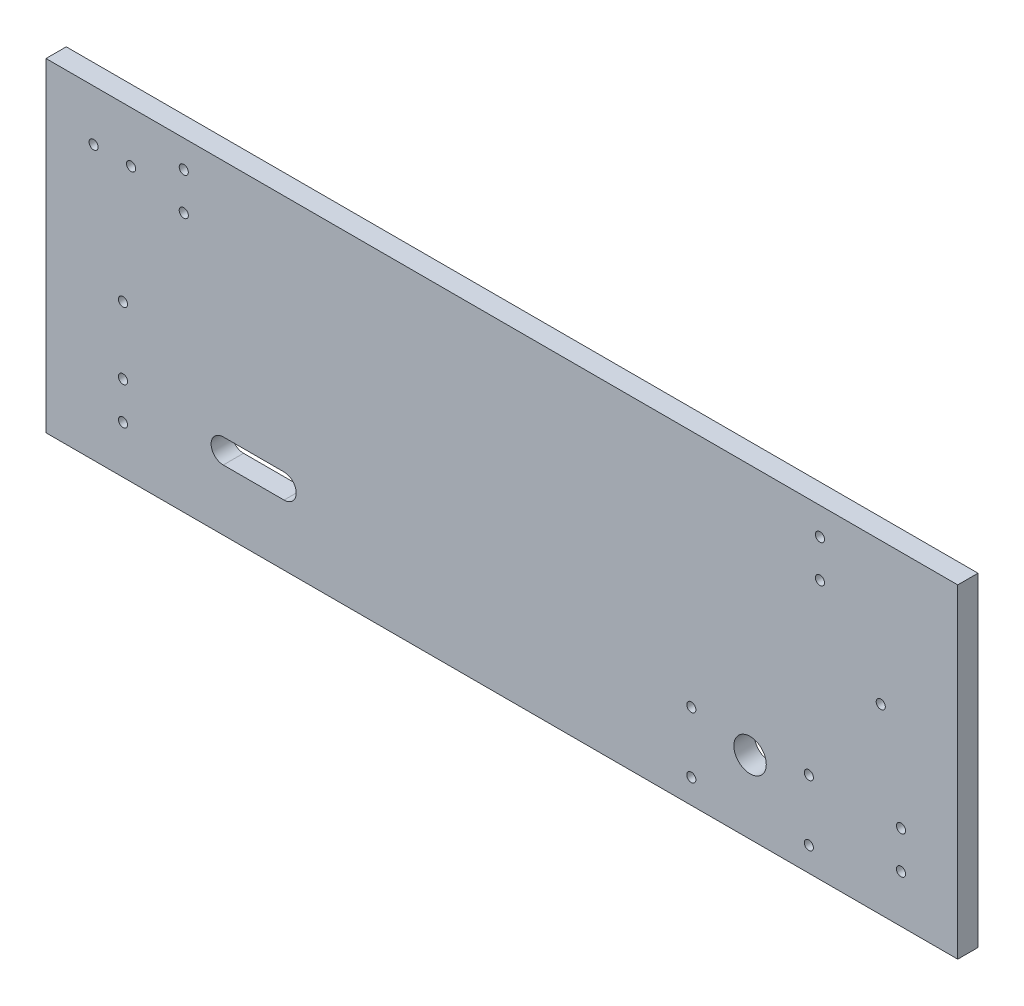
ISO-10303-21;
HEADER;
FILE_DESCRIPTION(('STEP AP214'),'2;1');
FILE_NAME('part.step','',(''),(''),'','','');
FILE_SCHEMA(('AUTOMOTIVE_DESIGN { 1 0 10303 214 1 1 1 1 }'));
ENDSEC;
DATA;
#1=APPLICATION_CONTEXT('core data for automotive mechanical design processes');
#2=APPLICATION_PROTOCOL_DEFINITION('international standard','automotive_design',2000,#1);
#3=PRODUCT_CONTEXT('',#1,'mechanical');
#4=PRODUCT('Part','Part','',(#3));
#5=PRODUCT_RELATED_PRODUCT_CATEGORY('part','',(#4));
#6=PRODUCT_DEFINITION_FORMATION('','',#4);
#7=PRODUCT_DEFINITION_CONTEXT('part definition',#1,'design');
#8=PRODUCT_DEFINITION('design','',#6,#7);
#9=PRODUCT_DEFINITION_SHAPE('','',#8);
#10=(LENGTH_UNIT() NAMED_UNIT(*) SI_UNIT(.MILLI.,.METRE.));
#11=(NAMED_UNIT(*) PLANE_ANGLE_UNIT() SI_UNIT($,.RADIAN.));
#12=(NAMED_UNIT(*) SI_UNIT($,.STERADIAN.) SOLID_ANGLE_UNIT());
#13=UNCERTAINTY_MEASURE_WITH_UNIT(LENGTH_MEASURE(1.E-05),#10,'distance_accuracy_value','');
#14=(GEOMETRIC_REPRESENTATION_CONTEXT(3) GLOBAL_UNCERTAINTY_ASSIGNED_CONTEXT((#13)) GLOBAL_UNIT_ASSIGNED_CONTEXT((#10,
#11,#12)) REPRESENTATION_CONTEXT('',''));
#15=CARTESIAN_POINT('',(0.,0.,0.));
#16=DIRECTION('',(0.,0.,1.));
#17=DIRECTION('',(1.,0.,0.));
#18=AXIS2_PLACEMENT_3D('',#15,#16,#17);
#19=CARTESIAN_POINT('',(0.,0.,10.));
#20=DIRECTION('',(1.,0.,0.));
#21=DIRECTION('',(0.,0.,-1.));
#22=AXIS2_PLACEMENT_3D('',#19,#20,#21);
#23=PLANE('',#22);
#24=DIRECTION('',(0.,-1.,0.));
#25=VECTOR('',#24,1.);
#26=CARTESIAN_POINT('',(0.,0.,0.));
#27=LINE('',#26,#25);
#28=CARTESIAN_POINT('',(0.,160.,0.));
#29=VERTEX_POINT('',#28);
#30=CARTESIAN_POINT('',(0.,0.,0.));
#31=VERTEX_POINT('',#30);
#32=EDGE_CURVE('E158',#29,#31,#27,.T.);
#33=ORIENTED_EDGE('',*,*,#32,.T.);
#34=DIRECTION('',(0.,0.,-1.));
#35=VECTOR('',#34,1.);
#36=CARTESIAN_POINT('',(0.,0.,10.));
#37=LINE('',#36,#35);
#38=CARTESIAN_POINT('',(0.,0.,10.));
#39=VERTEX_POINT('',#38);
#40=EDGE_CURVE('E11',#39,#31,#37,.T.);
#41=ORIENTED_EDGE('',*,*,#40,.F.);
#42=DIRECTION('',(0.,-1.,0.));
#43=VECTOR('',#42,1.);
#44=CARTESIAN_POINT('',(0.,0.,10.));
#45=LINE('',#44,#43);
#46=CARTESIAN_POINT('',(0.,160.,10.));
#47=VERTEX_POINT('',#46);
#48=EDGE_CURVE('E160',#47,#39,#45,.T.);
#49=ORIENTED_EDGE('',*,*,#48,.F.);
#50=DIRECTION('',(0.,0.,-1.));
#51=VECTOR('',#50,1.);
#52=CARTESIAN_POINT('',(0.,160.,10.));
#53=LINE('',#52,#51);
#54=EDGE_CURVE('E170',#47,#29,#53,.T.);
#55=ORIENTED_EDGE('',*,*,#54,.T.);
#56=EDGE_LOOP('',(#33,#41,#49,#55));
#57=FACE_BOUND('',#56,.T.);
#58=ADVANCED_FACE('F37',(#57),#23,.F.);
#59=CARTESIAN_POINT('',(0.,0.,10.));
#60=DIRECTION('',(0.,1.,0.));
#61=DIRECTION('',(0.,0.,1.));
#62=AXIS2_PLACEMENT_3D('',#59,#60,#61);
#63=PLANE('',#62);
#64=DIRECTION('',(1.,0.,0.));
#65=VECTOR('',#64,1.);
#66=CARTESIAN_POINT('',(0.,0.,0.));
#67=LINE('',#66,#65);
#68=CARTESIAN_POINT('',(450.,0.,0.));
#69=VERTEX_POINT('',#68);
#70=EDGE_CURVE('E173',#31,#69,#67,.T.);
#71=ORIENTED_EDGE('',*,*,#70,.T.);
#72=DIRECTION('',(0.,0.,-1.));
#73=VECTOR('',#72,1.);
#74=CARTESIAN_POINT('',(450.,0.,10.));
#75=LINE('',#74,#73);
#76=CARTESIAN_POINT('',(450.,0.,10.));
#77=VERTEX_POINT('',#76);
#78=EDGE_CURVE('E44',#77,#69,#75,.T.);
#79=ORIENTED_EDGE('',*,*,#78,.F.);
#80=DIRECTION('',(1.,0.,0.));
#81=VECTOR('',#80,1.);
#82=CARTESIAN_POINT('',(0.,0.,10.));
#83=LINE('',#82,#81);
#84=EDGE_CURVE('E163',#39,#77,#83,.T.);
#85=ORIENTED_EDGE('',*,*,#84,.F.);
#86=ORIENTED_EDGE('',*,*,#40,.T.);
#87=EDGE_LOOP('',(#71,#79,#85,#86));
#88=FACE_BOUND('',#87,.T.);
#89=ADVANCED_FACE('F202',(#88),#63,.F.);
#90=CARTESIAN_POINT('',(450.,0.,10.));
#91=DIRECTION('',(-1.,0.,0.));
#92=DIRECTION('',(0.,0.,1.));
#93=AXIS2_PLACEMENT_3D('',#90,#91,#92);
#94=PLANE('',#93);
#95=DIRECTION('',(0.,1.,0.));
#96=VECTOR('',#95,1.);
#97=CARTESIAN_POINT('',(450.,0.,0.));
#98=LINE('',#97,#96);
#99=CARTESIAN_POINT('',(450.,160.,0.));
#100=VERTEX_POINT('',#99);
#101=EDGE_CURVE('E175',#69,#100,#98,.T.);
#102=ORIENTED_EDGE('',*,*,#101,.T.);
#103=DIRECTION('',(0.,0.,-1.));
#104=VECTOR('',#103,1.);
#105=CARTESIAN_POINT('',(450.,160.,10.));
#106=LINE('',#105,#104);
#107=CARTESIAN_POINT('',(450.,160.,10.));
#108=VERTEX_POINT('',#107);
#109=EDGE_CURVE('E180',#108,#100,#106,.T.);
#110=ORIENTED_EDGE('',*,*,#109,.F.);
#111=DIRECTION('',(0.,1.,0.));
#112=VECTOR('',#111,1.);
#113=CARTESIAN_POINT('',(450.,0.,10.));
#114=LINE('',#113,#112);
#115=EDGE_CURVE('E166',#77,#108,#114,.T.);
#116=ORIENTED_EDGE('',*,*,#115,.F.);
#117=ORIENTED_EDGE('',*,*,#78,.T.);
#118=EDGE_LOOP('',(#102,#110,#116,#117));
#119=FACE_BOUND('',#118,.T.);
#120=ADVANCED_FACE('F187',(#119),#94,.F.);
#121=CARTESIAN_POINT('',(0.,160.,10.));
#122=DIRECTION('',(0.,-1.,0.));
#123=DIRECTION('',(0.,0.,-1.));
#124=AXIS2_PLACEMENT_3D('',#121,#122,#123);
#125=PLANE('',#124);
#126=DIRECTION('',(-1.,0.,0.));
#127=VECTOR('',#126,1.);
#128=CARTESIAN_POINT('',(0.,160.,0.));
#129=LINE('',#128,#127);
#130=EDGE_CURVE('E164',#100,#29,#129,.T.);
#131=ORIENTED_EDGE('',*,*,#130,.T.);
#132=ORIENTED_EDGE('',*,*,#54,.F.);
#133=DIRECTION('',(-1.,0.,0.));
#134=VECTOR('',#133,1.);
#135=CARTESIAN_POINT('',(0.,160.,10.));
#136=LINE('',#135,#134);
#137=EDGE_CURVE('E168',#108,#47,#136,.T.);
#138=ORIENTED_EDGE('',*,*,#137,.F.);
#139=ORIENTED_EDGE('',*,*,#109,.T.);
#140=EDGE_LOOP('',(#131,#132,#138,#139));
#141=FACE_BOUND('',#140,.T.);
#142=ADVANCED_FACE('F196',(#141),#125,.F.);
#143=CARTESIAN_POINT('',(0.,0.,10.));
#144=DIRECTION('',(0.,0.,-1.));
#145=DIRECTION('',(-1.,0.,0.));
#146=AXIS2_PLACEMENT_3D('',#143,#144,#145);
#147=PLANE('',#146);
#148=CARTESIAN_POINT('',(382.,146.5,10.));
#149=DIRECTION('',(0.,0.,1.));
#150=DIRECTION('',(1.,0.,0.));
#151=AXIS2_PLACEMENT_3D('',#148,#149,#150);
#152=CIRCLE('',#151,2.24999999999996);
#153=CARTESIAN_POINT('',(384.25,146.5,10.));
#154=VERTEX_POINT('',#153);
#155=EDGE_CURVE('E341',#154,#154,#152,.T.);
#156=ORIENTED_EDGE('',*,*,#155,.F.);
#157=EDGE_LOOP('',(#156));
#158=FACE_BOUND('',#157,.T.);
#159=CARTESIAN_POINT('',(68.,128.,10.));
#160=DIRECTION('',(0.,0.,1.));
#161=DIRECTION('',(1.,0.,0.));
#162=AXIS2_PLACEMENT_3D('',#159,#160,#161);
#163=CIRCLE('',#162,2.25);
#164=CARTESIAN_POINT('',(70.25,128.,10.));
#165=VERTEX_POINT('',#164);
#166=EDGE_CURVE('E334',#165,#165,#163,.T.);
#167=ORIENTED_EDGE('',*,*,#166,.F.);
#168=EDGE_LOOP('',(#167));
#169=FACE_BOUND('',#168,.T.);
#170=CARTESIAN_POINT('',(412.,90.,10.));
#171=DIRECTION('',(0.,0.,1.));
#172=DIRECTION('',(1.,0.,0.));
#173=AXIS2_PLACEMENT_3D('',#170,#171,#172);
#174=CIRCLE('',#173,2.24999999999995);
#175=CARTESIAN_POINT('',(414.25,90.,10.));
#176=VERTEX_POINT('',#175);
#177=EDGE_CURVE('E353',#176,#176,#174,.T.);
#178=ORIENTED_EDGE('',*,*,#177,.F.);
#179=EDGE_LOOP('',(#178));
#180=FACE_BOUND('',#179,.T.);
#181=CARTESIAN_POINT('',(68.,146.5,10.));
#182=DIRECTION('',(0.,0.,1.));
#183=DIRECTION('',(1.,0.,0.));
#184=AXIS2_PLACEMENT_3D('',#181,#182,#183);
#185=CIRCLE('',#184,2.25);
#186=CARTESIAN_POINT('',(70.25,146.5,10.));
#187=VERTEX_POINT('',#186);
#188=EDGE_CURVE('E346',#187,#187,#185,.T.);
#189=ORIENTED_EDGE('',*,*,#188,.F.);
#190=EDGE_LOOP('',(#189));
#191=FACE_BOUND('',#190,.T.);
#192=CARTESIAN_POINT('',(422.,41.9999999999999,10.));
#193=DIRECTION('',(0.,0.,1.));
#194=DIRECTION('',(1.,0.,0.));
#195=AXIS2_PLACEMENT_3D('',#192,#193,#194);
#196=CIRCLE('',#195,2.24999999999995);
#197=CARTESIAN_POINT('',(424.25,41.9999999999999,10.));
#198=VERTEX_POINT('',#197);
#199=EDGE_CURVE('E309',#198,#198,#196,.T.);
#200=ORIENTED_EDGE('',*,*,#199,.F.);
#201=EDGE_LOOP('',(#200));
#202=FACE_BOUND('',#201,.T.);
#203=CARTESIAN_POINT('',(38.,23.5,10.));
#204=DIRECTION('',(0.,0.,1.));
#205=DIRECTION('',(1.,0.,0.));
#206=AXIS2_PLACEMENT_3D('',#203,#204,#205);
#207=CIRCLE('',#206,2.25);
#208=CARTESIAN_POINT('',(40.25,23.5,10.));
#209=VERTEX_POINT('',#208);
#210=EDGE_CURVE('E313',#209,#209,#207,.T.);
#211=ORIENTED_EDGE('',*,*,#210,.F.);
#212=EDGE_LOOP('',(#211));
#213=FACE_BOUND('',#212,.T.);
#214=CARTESIAN_POINT('',(38.,42.,10.));
#215=DIRECTION('',(0.,0.,1.));
#216=DIRECTION('',(1.,0.,0.));
#217=AXIS2_PLACEMENT_3D('',#214,#215,#216);
#218=CIRCLE('',#217,2.25);
#219=CARTESIAN_POINT('',(40.25,42.,10.));
#220=VERTEX_POINT('',#219);
#221=EDGE_CURVE('E329',#220,#220,#218,.T.);
#222=ORIENTED_EDGE('',*,*,#221,.F.);
#223=EDGE_LOOP('',(#222));
#224=FACE_BOUND('',#223,.T.);
#225=CARTESIAN_POINT('',(382.,128.,10.));
#226=DIRECTION('',(0.,0.,1.));
#227=DIRECTION('',(1.,0.,0.));
#228=AXIS2_PLACEMENT_3D('',#225,#226,#227);
#229=CIRCLE('',#228,2.24999999999996);
#230=CARTESIAN_POINT('',(384.25,128.,10.));
#231=VERTEX_POINT('',#230);
#232=EDGE_CURVE('E322',#231,#231,#229,.T.);
#233=ORIENTED_EDGE('',*,*,#232,.F.);
#234=EDGE_LOOP('',(#233));
#235=FACE_BOUND('',#234,.T.);
#236=DIRECTION('',(1.,0.,0.));
#237=VECTOR('',#236,1.);
#238=CARTESIAN_POINT('',(87.5,30.,10.));
#239=LINE('',#238,#237);
#240=CARTESIAN_POINT('',(87.5,30.,10.));
#241=VERTEX_POINT('',#240);
#242=CARTESIAN_POINT('',(117.5,30.,10.));
#243=VERTEX_POINT('',#242);
#244=EDGE_CURVE('E122',#241,#243,#239,.T.);
#245=ORIENTED_EDGE('',*,*,#244,.F.);
#246=CARTESIAN_POINT('',(87.5,36.,10.));
#247=DIRECTION('',(0.,0.,1.));
#248=DIRECTION('',(1.,0.,0.));
#249=AXIS2_PLACEMENT_3D('',#246,#247,#248);
#250=CIRCLE('',#249,6.);
#251=CARTESIAN_POINT('',(87.5,42.,10.));
#252=VERTEX_POINT('',#251);
#253=EDGE_CURVE('E51',#252,#241,#250,.T.);
#254=ORIENTED_EDGE('',*,*,#253,.F.);
#255=DIRECTION('',(-1.,0.,0.));
#256=VECTOR('',#255,1.);
#257=CARTESIAN_POINT('',(87.5,42.,10.));
#258=LINE('',#257,#256);
#259=CARTESIAN_POINT('',(117.5,42.,10.));
#260=VERTEX_POINT('',#259);
#261=EDGE_CURVE('E111',#260,#252,#258,.T.);
#262=ORIENTED_EDGE('',*,*,#261,.F.);
#263=CARTESIAN_POINT('',(117.5,36.,10.));
#264=DIRECTION('',(0.,0.,1.));
#265=DIRECTION('',(1.,0.,0.));
#266=AXIS2_PLACEMENT_3D('',#263,#264,#265);
#267=CIRCLE('',#266,6.);
#268=EDGE_CURVE('E116',#243,#260,#267,.T.);
#269=ORIENTED_EDGE('',*,*,#268,.F.);
#270=EDGE_LOOP('',(#245,#254,#262,#269));
#271=FACE_BOUND('',#270,.T.);
#272=CARTESIAN_POINT('',(376.5,42.,10.));
#273=DIRECTION('',(0.,0.,1.));
#274=DIRECTION('',(1.,0.,0.));
#275=AXIS2_PLACEMENT_3D('',#272,#273,#274);
#276=CIRCLE('',#275,2.24999999999995);
#277=CARTESIAN_POINT('',(378.75,42.,10.));
#278=VERTEX_POINT('',#277);
#279=EDGE_CURVE('E108',#278,#278,#276,.T.);
#280=ORIENTED_EDGE('',*,*,#279,.F.);
#281=EDGE_LOOP('',(#280));
#282=FACE_BOUND('',#281,.T.);
#283=CARTESIAN_POINT('',(376.5,12.,10.));
#284=DIRECTION('',(0.,0.,1.));
#285=DIRECTION('',(1.,0.,0.));
#286=AXIS2_PLACEMENT_3D('',#283,#284,#285);
#287=CIRCLE('',#286,2.24999999999995);
#288=CARTESIAN_POINT('',(378.75,12.,10.));
#289=VERTEX_POINT('',#288);
#290=EDGE_CURVE('E144',#289,#289,#287,.T.);
#291=ORIENTED_EDGE('',*,*,#290,.F.);
#292=EDGE_LOOP('',(#291));
#293=FACE_BOUND('',#292,.T.);
#294=CARTESIAN_POINT('',(318.5,12.,10.));
#295=DIRECTION('',(0.,0.,1.));
#296=DIRECTION('',(1.,0.,0.));
#297=AXIS2_PLACEMENT_3D('',#294,#295,#296);
#298=CIRCLE('',#297,2.24999999999995);
#299=CARTESIAN_POINT('',(320.75,12.,10.));
#300=VERTEX_POINT('',#299);
#301=EDGE_CURVE('E150',#300,#300,#298,.T.);
#302=ORIENTED_EDGE('',*,*,#301,.F.);
#303=EDGE_LOOP('',(#302));
#304=FACE_BOUND('',#303,.T.);
#305=CARTESIAN_POINT('',(38.,75.,10.));
#306=DIRECTION('',(0.,0.,1.));
#307=DIRECTION('',(1.,0.,0.));
#308=AXIS2_PLACEMENT_3D('',#305,#306,#307);
#309=CIRCLE('',#308,2.25);
#310=CARTESIAN_POINT('',(40.25,75.,10.));
#311=VERTEX_POINT('',#310);
#312=EDGE_CURVE('E365',#311,#311,#309,.T.);
#313=ORIENTED_EDGE('',*,*,#312,.F.);
#314=EDGE_LOOP('',(#313));
#315=FACE_BOUND('',#314,.T.);
#316=CARTESIAN_POINT('',(42.,134.933694221876,10.));
#317=DIRECTION('',(0.,0.,1.));
#318=DIRECTION('',(1.,0.,0.));
#319=AXIS2_PLACEMENT_3D('',#316,#317,#318);
#320=CIRCLE('',#319,2.25);
#321=CARTESIAN_POINT('',(44.25,134.933694221876,10.));
#322=VERTEX_POINT('',#321);
#323=EDGE_CURVE('E358',#322,#322,#320,.T.);
#324=ORIENTED_EDGE('',*,*,#323,.F.);
#325=EDGE_LOOP('',(#324));
#326=FACE_BOUND('',#325,.T.);
#327=CARTESIAN_POINT('',(23.5,134.933694221876,10.));
#328=DIRECTION('',(0.,0.,1.));
#329=DIRECTION('',(1.,0.,0.));
#330=AXIS2_PLACEMENT_3D('',#327,#328,#329);
#331=CIRCLE('',#330,2.25);
#332=CARTESIAN_POINT('',(25.75,134.933694221876,10.));
#333=VERTEX_POINT('',#332);
#334=EDGE_CURVE('E375',#333,#333,#331,.T.);
#335=ORIENTED_EDGE('',*,*,#334,.F.);
#336=EDGE_LOOP('',(#335));
#337=FACE_BOUND('',#336,.T.);
#338=CARTESIAN_POINT('',(318.5,42.,10.));
#339=DIRECTION('',(0.,0.,1.));
#340=DIRECTION('',(1.,0.,0.));
#341=AXIS2_PLACEMENT_3D('',#338,#339,#340);
#342=CIRCLE('',#341,2.24999999999995);
#343=CARTESIAN_POINT('',(320.75,42.,10.));
#344=VERTEX_POINT('',#343);
#345=EDGE_CURVE('E156',#344,#344,#342,.T.);
#346=ORIENTED_EDGE('',*,*,#345,.F.);
#347=EDGE_LOOP('',(#346));
#348=FACE_BOUND('',#347,.T.);
#349=CARTESIAN_POINT('',(422.,23.4999999999999,10.));
#350=DIRECTION('',(0.,0.,1.));
#351=DIRECTION('',(1.,0.,0.));
#352=AXIS2_PLACEMENT_3D('',#349,#350,#351);
#353=CIRCLE('',#352,2.24999999999995);
#354=CARTESIAN_POINT('',(424.25,23.4999999999999,10.));
#355=VERTEX_POINT('',#354);
#356=EDGE_CURVE('E304',#355,#355,#353,.T.);
#357=ORIENTED_EDGE('',*,*,#356,.F.);
#358=EDGE_LOOP('',(#357));
#359=FACE_BOUND('',#358,.T.);
#360=CARTESIAN_POINT('',(347.5,36.,10.));
#361=DIRECTION('',(0.,0.,1.));
#362=DIRECTION('',(1.,0.,0.));
#363=AXIS2_PLACEMENT_3D('',#360,#361,#362);
#364=CIRCLE('',#363,7.99999999999998);
#365=CARTESIAN_POINT('',(355.5,36.,10.));
#366=VERTEX_POINT('',#365);
#367=EDGE_CURVE('E123',#366,#366,#364,.T.);
#368=ORIENTED_EDGE('',*,*,#367,.F.);
#369=EDGE_LOOP('',(#368));
#370=FACE_BOUND('',#369,.T.);
#371=ORIENTED_EDGE('',*,*,#48,.T.);
#372=ORIENTED_EDGE('',*,*,#84,.T.);
#373=ORIENTED_EDGE('',*,*,#115,.T.);
#374=ORIENTED_EDGE('',*,*,#137,.T.);
#375=EDGE_LOOP('',(#371,#372,#373,#374));
#376=FACE_BOUND('',#375,.T.);
#377=ADVANCED_FACE('F119',(#158,#169,#180,#191,#202,#213,#224,#235,#271,#282,#293,#304,#315,
#326,#337,#348,#359,#370,#376),#147,.F.);
#378=CARTESIAN_POINT('',(0.,0.,0.));
#379=DIRECTION('',(0.,0.,-1.));
#380=DIRECTION('',(-1.,0.,0.));
#381=AXIS2_PLACEMENT_3D('',#378,#379,#380);
#382=PLANE('',#381);
#383=CARTESIAN_POINT('',(382.,146.5,0.));
#384=DIRECTION('',(0.,0.,1.));
#385=DIRECTION('',(1.,0.,0.));
#386=AXIS2_PLACEMENT_3D('',#383,#384,#385);
#387=CIRCLE('',#386,2.24999999999996);
#388=CARTESIAN_POINT('',(384.25,146.5,0.));
#389=VERTEX_POINT('',#388);
#390=EDGE_CURVE('E325',#389,#389,#387,.T.);
#391=ORIENTED_EDGE('',*,*,#390,.T.);
#392=EDGE_LOOP('',(#391));
#393=FACE_BOUND('',#392,.T.);
#394=CARTESIAN_POINT('',(68.,128.,0.));
#395=DIRECTION('',(0.,0.,1.));
#396=DIRECTION('',(1.,0.,0.));
#397=AXIS2_PLACEMENT_3D('',#394,#395,#396);
#398=CIRCLE('',#397,2.25);
#399=CARTESIAN_POINT('',(70.25,128.,0.));
#400=VERTEX_POINT('',#399);
#401=EDGE_CURVE('E338',#400,#400,#398,.T.);
#402=ORIENTED_EDGE('',*,*,#401,.T.);
#403=EDGE_LOOP('',(#402));
#404=FACE_BOUND('',#403,.T.);
#405=CARTESIAN_POINT('',(412.,90.,0.));
#406=DIRECTION('',(0.,0.,1.));
#407=DIRECTION('',(1.,0.,0.));
#408=AXIS2_PLACEMENT_3D('',#405,#406,#407);
#409=CIRCLE('',#408,2.24999999999995);
#410=CARTESIAN_POINT('',(414.25,90.,0.));
#411=VERTEX_POINT('',#410);
#412=EDGE_CURVE('E337',#411,#411,#409,.T.);
#413=ORIENTED_EDGE('',*,*,#412,.T.);
#414=EDGE_LOOP('',(#413));
#415=FACE_BOUND('',#414,.T.);
#416=CARTESIAN_POINT('',(68.,146.5,0.));
#417=DIRECTION('',(0.,0.,1.));
#418=DIRECTION('',(1.,0.,0.));
#419=AXIS2_PLACEMENT_3D('',#416,#417,#418);
#420=CIRCLE('',#419,2.25);
#421=CARTESIAN_POINT('',(70.25,146.5,0.));
#422=VERTEX_POINT('',#421);
#423=EDGE_CURVE('E350',#422,#422,#420,.T.);
#424=ORIENTED_EDGE('',*,*,#423,.T.);
#425=EDGE_LOOP('',(#424));
#426=FACE_BOUND('',#425,.T.);
#427=CARTESIAN_POINT('',(422.,41.9999999999999,0.));
#428=DIRECTION('',(0.,0.,1.));
#429=DIRECTION('',(1.,0.,0.));
#430=AXIS2_PLACEMENT_3D('',#427,#428,#429);
#431=CIRCLE('',#430,2.24999999999995);
#432=CARTESIAN_POINT('',(424.25,41.9999999999999,0.));
#433=VERTEX_POINT('',#432);
#434=EDGE_CURVE('E306',#433,#433,#431,.T.);
#435=ORIENTED_EDGE('',*,*,#434,.T.);
#436=EDGE_LOOP('',(#435));
#437=FACE_BOUND('',#436,.T.);
#438=CARTESIAN_POINT('',(38.,23.5,0.));
#439=DIRECTION('',(0.,0.,1.));
#440=DIRECTION('',(1.,0.,0.));
#441=AXIS2_PLACEMENT_3D('',#438,#439,#440);
#442=CIRCLE('',#441,2.25);
#443=CARTESIAN_POINT('',(40.25,23.5,0.));
#444=VERTEX_POINT('',#443);
#445=EDGE_CURVE('E317',#444,#444,#442,.T.);
#446=ORIENTED_EDGE('',*,*,#445,.T.);
#447=EDGE_LOOP('',(#446));
#448=FACE_BOUND('',#447,.T.);
#449=CARTESIAN_POINT('',(38.,42.,0.));
#450=DIRECTION('',(0.,0.,1.));
#451=DIRECTION('',(1.,0.,0.));
#452=AXIS2_PLACEMENT_3D('',#449,#450,#451);
#453=CIRCLE('',#452,2.25);
#454=CARTESIAN_POINT('',(40.25,42.,0.));
#455=VERTEX_POINT('',#454);
#456=EDGE_CURVE('E316',#455,#455,#453,.T.);
#457=ORIENTED_EDGE('',*,*,#456,.T.);
#458=EDGE_LOOP('',(#457));
#459=FACE_BOUND('',#458,.T.);
#460=CARTESIAN_POINT('',(382.,128.,0.));
#461=DIRECTION('',(0.,0.,1.));
#462=DIRECTION('',(1.,0.,0.));
#463=AXIS2_PLACEMENT_3D('',#460,#461,#462);
#464=CIRCLE('',#463,2.24999999999996);
#465=CARTESIAN_POINT('',(384.25,128.,0.));
#466=VERTEX_POINT('',#465);
#467=EDGE_CURVE('E326',#466,#466,#464,.T.);
#468=ORIENTED_EDGE('',*,*,#467,.T.);
#469=EDGE_LOOP('',(#468));
#470=FACE_BOUND('',#469,.T.);
#471=CARTESIAN_POINT('',(87.5,36.,0.));
#472=DIRECTION('',(0.,0.,1.));
#473=DIRECTION('',(1.,0.,0.));
#474=AXIS2_PLACEMENT_3D('',#471,#472,#473);
#475=CIRCLE('',#474,6.);
#476=CARTESIAN_POINT('',(87.5,42.,0.));
#477=VERTEX_POINT('',#476);
#478=CARTESIAN_POINT('',(87.5,30.,0.));
#479=VERTEX_POINT('',#478);
#480=EDGE_CURVE('E103',#477,#479,#475,.T.);
#481=ORIENTED_EDGE('',*,*,#480,.T.);
#482=DIRECTION('',(1.,0.,0.));
#483=VECTOR('',#482,1.);
#484=CARTESIAN_POINT('',(87.5,30.,0.));
#485=LINE('',#484,#483);
#486=CARTESIAN_POINT('',(117.5,30.,0.));
#487=VERTEX_POINT('',#486);
#488=EDGE_CURVE('E135',#479,#487,#485,.T.);
#489=ORIENTED_EDGE('',*,*,#488,.T.);
#490=CARTESIAN_POINT('',(117.5,36.,0.));
#491=DIRECTION('',(0.,0.,1.));
#492=DIRECTION('',(1.,0.,0.));
#493=AXIS2_PLACEMENT_3D('',#490,#491,#492);
#494=CIRCLE('',#493,6.);
#495=CARTESIAN_POINT('',(117.5,42.,0.));
#496=VERTEX_POINT('',#495);
#497=EDGE_CURVE('E59',#487,#496,#494,.T.);
#498=ORIENTED_EDGE('',*,*,#497,.T.);
#499=DIRECTION('',(-1.,0.,0.));
#500=VECTOR('',#499,1.);
#501=CARTESIAN_POINT('',(87.5,42.,0.));
#502=LINE('',#501,#500);
#503=EDGE_CURVE('E131',#496,#477,#502,.T.);
#504=ORIENTED_EDGE('',*,*,#503,.T.);
#505=EDGE_LOOP('',(#481,#489,#498,#504));
#506=FACE_BOUND('',#505,.T.);
#507=CARTESIAN_POINT('',(376.5,42.,0.));
#508=DIRECTION('',(0.,0.,1.));
#509=DIRECTION('',(1.,0.,0.));
#510=AXIS2_PLACEMENT_3D('',#507,#508,#509);
#511=CIRCLE('',#510,2.24999999999995);
#512=CARTESIAN_POINT('',(378.75,42.,0.));
#513=VERTEX_POINT('',#512);
#514=EDGE_CURVE('E141',#513,#513,#511,.T.);
#515=ORIENTED_EDGE('',*,*,#514,.T.);
#516=EDGE_LOOP('',(#515));
#517=FACE_BOUND('',#516,.T.);
#518=CARTESIAN_POINT('',(376.5,12.,0.));
#519=DIRECTION('',(0.,0.,1.));
#520=DIRECTION('',(1.,0.,0.));
#521=AXIS2_PLACEMENT_3D('',#518,#519,#520);
#522=CIRCLE('',#521,2.24999999999995);
#523=CARTESIAN_POINT('',(378.75,12.,0.));
#524=VERTEX_POINT('',#523);
#525=EDGE_CURVE('E147',#524,#524,#522,.T.);
#526=ORIENTED_EDGE('',*,*,#525,.T.);
#527=EDGE_LOOP('',(#526));
#528=FACE_BOUND('',#527,.T.);
#529=CARTESIAN_POINT('',(318.5,12.,0.));
#530=DIRECTION('',(0.,0.,1.));
#531=DIRECTION('',(1.,0.,0.));
#532=AXIS2_PLACEMENT_3D('',#529,#530,#531);
#533=CIRCLE('',#532,2.24999999999995);
#534=CARTESIAN_POINT('',(320.75,12.,0.));
#535=VERTEX_POINT('',#534);
#536=EDGE_CURVE('E153',#535,#535,#533,.T.);
#537=ORIENTED_EDGE('',*,*,#536,.T.);
#538=EDGE_LOOP('',(#537));
#539=FACE_BOUND('',#538,.T.);
#540=CARTESIAN_POINT('',(38.,75.,0.));
#541=DIRECTION('',(0.,0.,1.));
#542=DIRECTION('',(1.,0.,0.));
#543=AXIS2_PLACEMENT_3D('',#540,#541,#542);
#544=CIRCLE('',#543,2.25);
#545=CARTESIAN_POINT('',(40.25,75.,0.));
#546=VERTEX_POINT('',#545);
#547=EDGE_CURVE('E349',#546,#546,#544,.T.);
#548=ORIENTED_EDGE('',*,*,#547,.T.);
#549=EDGE_LOOP('',(#548));
#550=FACE_BOUND('',#549,.T.);
#551=CARTESIAN_POINT('',(42.,134.933694221876,0.));
#552=DIRECTION('',(0.,0.,1.));
#553=DIRECTION('',(1.,0.,0.));
#554=AXIS2_PLACEMENT_3D('',#551,#552,#553);
#555=CIRCLE('',#554,2.25);
#556=CARTESIAN_POINT('',(44.25,134.933694221876,0.));
#557=VERTEX_POINT('',#556);
#558=EDGE_CURVE('E362',#557,#557,#555,.T.);
#559=ORIENTED_EDGE('',*,*,#558,.T.);
#560=EDGE_LOOP('',(#559));
#561=FACE_BOUND('',#560,.T.);
#562=CARTESIAN_POINT('',(23.5,134.933694221876,0.));
#563=DIRECTION('',(0.,0.,1.));
#564=DIRECTION('',(1.,0.,0.));
#565=AXIS2_PLACEMENT_3D('',#562,#563,#564);
#566=CIRCLE('',#565,2.25);
#567=CARTESIAN_POINT('',(25.75,134.933694221876,0.));
#568=VERTEX_POINT('',#567);
#569=EDGE_CURVE('E361',#568,#568,#566,.T.);
#570=ORIENTED_EDGE('',*,*,#569,.T.);
#571=EDGE_LOOP('',(#570));
#572=FACE_BOUND('',#571,.T.);
#573=CARTESIAN_POINT('',(318.5,42.,0.));
#574=DIRECTION('',(0.,0.,1.));
#575=DIRECTION('',(1.,0.,0.));
#576=AXIS2_PLACEMENT_3D('',#573,#574,#575);
#577=CIRCLE('',#576,2.24999999999995);
#578=CARTESIAN_POINT('',(320.75,42.,0.));
#579=VERTEX_POINT('',#578);
#580=EDGE_CURVE('E372',#579,#579,#577,.T.);
#581=ORIENTED_EDGE('',*,*,#580,.T.);
#582=EDGE_LOOP('',(#581));
#583=FACE_BOUND('',#582,.T.);
#584=CARTESIAN_POINT('',(422.,23.4999999999999,0.));
#585=DIRECTION('',(0.,0.,1.));
#586=DIRECTION('',(1.,0.,0.));
#587=AXIS2_PLACEMENT_3D('',#584,#585,#586);
#588=CIRCLE('',#587,2.24999999999995);
#589=CARTESIAN_POINT('',(424.25,23.4999999999999,0.));
#590=VERTEX_POINT('',#589);
#591=EDGE_CURVE('E301',#590,#590,#588,.T.);
#592=ORIENTED_EDGE('',*,*,#591,.T.);
#593=EDGE_LOOP('',(#592));
#594=FACE_BOUND('',#593,.T.);
#595=CARTESIAN_POINT('',(347.5,36.,0.));
#596=DIRECTION('',(0.,0.,1.));
#597=DIRECTION('',(1.,0.,0.));
#598=AXIS2_PLACEMENT_3D('',#595,#596,#597);
#599=CIRCLE('',#598,7.99999999999998);
#600=CARTESIAN_POINT('',(355.5,36.,0.));
#601=VERTEX_POINT('',#600);
#602=EDGE_CURVE('E126',#601,#601,#599,.T.);
#603=ORIENTED_EDGE('',*,*,#602,.T.);
#604=EDGE_LOOP('',(#603));
#605=FACE_BOUND('',#604,.T.);
#606=ORIENTED_EDGE('',*,*,#32,.F.);
#607=ORIENTED_EDGE('',*,*,#130,.F.);
#608=ORIENTED_EDGE('',*,*,#101,.F.);
#609=ORIENTED_EDGE('',*,*,#70,.F.);
#610=EDGE_LOOP('',(#606,#607,#608,#609));
#611=FACE_BOUND('',#610,.T.);
#612=ADVANCED_FACE('F193',(#393,#404,#415,#426,#437,#448,#459,#470,#506,#517,#528,#539,#550,
#561,#572,#583,#594,#605,#611),#382,.T.);
#613=CARTESIAN_POINT('',(347.5,36.,0.));
#614=DIRECTION('',(0.,0.,1.));
#615=DIRECTION('',(1.,0.,0.));
#616=AXIS2_PLACEMENT_3D('',#613,#614,#615);
#617=CYLINDRICAL_SURFACE('',#616,7.99999999999998);
#618=ORIENTED_EDGE('',*,*,#602,.F.);
#619=EDGE_LOOP('',(#618));
#620=FACE_BOUND('',#619,.T.);
#621=ORIENTED_EDGE('',*,*,#367,.T.);
#622=EDGE_LOOP('',(#621));
#623=FACE_BOUND('',#622,.T.);
#624=ADVANCED_FACE('F214',(#620,#623),#617,.F.);
#625=CARTESIAN_POINT('',(422.,23.4999999999999,0.));
#626=DIRECTION('',(0.,0.,1.));
#627=DIRECTION('',(1.,0.,0.));
#628=AXIS2_PLACEMENT_3D('',#625,#626,#627);
#629=CYLINDRICAL_SURFACE('',#628,2.24999999999995);
#630=ORIENTED_EDGE('',*,*,#591,.F.);
#631=EDGE_LOOP('',(#630));
#632=FACE_BOUND('',#631,.T.);
#633=ORIENTED_EDGE('',*,*,#356,.T.);
#634=EDGE_LOOP('',(#633));
#635=FACE_BOUND('',#634,.T.);
#636=ADVANCED_FACE('F221',(#632,#635),#629,.F.);
#637=CARTESIAN_POINT('',(318.5,42.,0.));
#638=DIRECTION('',(0.,0.,1.));
#639=DIRECTION('',(1.,0.,0.));
#640=AXIS2_PLACEMENT_3D('',#637,#638,#639);
#641=CYLINDRICAL_SURFACE('',#640,2.24999999999995);
#642=ORIENTED_EDGE('',*,*,#580,.F.);
#643=EDGE_LOOP('',(#642));
#644=FACE_BOUND('',#643,.T.);
#645=ORIENTED_EDGE('',*,*,#345,.T.);
#646=EDGE_LOOP('',(#645));
#647=FACE_BOUND('',#646,.T.);
#648=ADVANCED_FACE('F252',(#644,#647),#641,.F.);
#649=CARTESIAN_POINT('',(23.5,134.933694221876,0.));
#650=DIRECTION('',(0.,0.,1.));
#651=DIRECTION('',(1.,0.,0.));
#652=AXIS2_PLACEMENT_3D('',#649,#650,#651);
#653=CYLINDRICAL_SURFACE('',#652,2.25);
#654=ORIENTED_EDGE('',*,*,#569,.F.);
#655=EDGE_LOOP('',(#654));
#656=FACE_BOUND('',#655,.T.);
#657=ORIENTED_EDGE('',*,*,#334,.T.);
#658=EDGE_LOOP('',(#657));
#659=FACE_BOUND('',#658,.T.);
#660=ADVANCED_FACE('F248',(#656,#659),#653,.F.);
#661=CARTESIAN_POINT('',(42.,134.933694221876,0.));
#662=DIRECTION('',(0.,0.,1.));
#663=DIRECTION('',(1.,0.,0.));
#664=AXIS2_PLACEMENT_3D('',#661,#662,#663);
#665=CYLINDRICAL_SURFACE('',#664,2.25);
#666=ORIENTED_EDGE('',*,*,#558,.F.);
#667=EDGE_LOOP('',(#666));
#668=FACE_BOUND('',#667,.T.);
#669=ORIENTED_EDGE('',*,*,#323,.T.);
#670=EDGE_LOOP('',(#669));
#671=FACE_BOUND('',#670,.T.);
#672=ADVANCED_FACE('F251',(#668,#671),#665,.F.);
#673=CARTESIAN_POINT('',(38.,75.,0.));
#674=DIRECTION('',(0.,0.,1.));
#675=DIRECTION('',(1.,0.,0.));
#676=AXIS2_PLACEMENT_3D('',#673,#674,#675);
#677=CYLINDRICAL_SURFACE('',#676,2.25);
#678=ORIENTED_EDGE('',*,*,#547,.F.);
#679=EDGE_LOOP('',(#678));
#680=FACE_BOUND('',#679,.T.);
#681=ORIENTED_EDGE('',*,*,#312,.T.);
#682=EDGE_LOOP('',(#681));
#683=FACE_BOUND('',#682,.T.);
#684=ADVANCED_FACE('F227',(#680,#683),#677,.F.);
#685=CARTESIAN_POINT('',(318.5,12.,0.));
#686=DIRECTION('',(0.,0.,1.));
#687=DIRECTION('',(1.,0.,0.));
#688=AXIS2_PLACEMENT_3D('',#685,#686,#687);
#689=CYLINDRICAL_SURFACE('',#688,2.24999999999995);
#690=ORIENTED_EDGE('',*,*,#536,.F.);
#691=EDGE_LOOP('',(#690));
#692=FACE_BOUND('',#691,.T.);
#693=ORIENTED_EDGE('',*,*,#301,.T.);
#694=EDGE_LOOP('',(#693));
#695=FACE_BOUND('',#694,.T.);
#696=ADVANCED_FACE('F223',(#692,#695),#689,.F.);
#697=CARTESIAN_POINT('',(376.5,12.,0.));
#698=DIRECTION('',(0.,0.,1.));
#699=DIRECTION('',(1.,0.,0.));
#700=AXIS2_PLACEMENT_3D('',#697,#698,#699);
#701=CYLINDRICAL_SURFACE('',#700,2.24999999999995);
#702=ORIENTED_EDGE('',*,*,#525,.F.);
#703=EDGE_LOOP('',(#702));
#704=FACE_BOUND('',#703,.T.);
#705=ORIENTED_EDGE('',*,*,#290,.T.);
#706=EDGE_LOOP('',(#705));
#707=FACE_BOUND('',#706,.T.);
#708=ADVANCED_FACE('F226',(#704,#707),#701,.F.);
#709=CARTESIAN_POINT('',(376.5,42.,0.));
#710=DIRECTION('',(0.,0.,1.));
#711=DIRECTION('',(1.,0.,0.));
#712=AXIS2_PLACEMENT_3D('',#709,#710,#711);
#713=CYLINDRICAL_SURFACE('',#712,2.24999999999995);
#714=ORIENTED_EDGE('',*,*,#514,.F.);
#715=EDGE_LOOP('',(#714));
#716=FACE_BOUND('',#715,.T.);
#717=ORIENTED_EDGE('',*,*,#279,.T.);
#718=EDGE_LOOP('',(#717));
#719=FACE_BOUND('',#718,.T.);
#720=ADVANCED_FACE('F231',(#716,#719),#713,.F.);
#721=CARTESIAN_POINT('',(87.5,36.,0.));
#722=DIRECTION('',(0.,0.,1.));
#723=DIRECTION('',(1.,0.,0.));
#724=AXIS2_PLACEMENT_3D('',#721,#722,#723);
#725=CYLINDRICAL_SURFACE('',#724,6.);
#726=ORIENTED_EDGE('',*,*,#253,.T.);
#727=DIRECTION('',(0.,0.,1.));
#728=VECTOR('',#727,1.);
#729=CARTESIAN_POINT('',(87.5,30.,0.));
#730=LINE('',#729,#728);
#731=EDGE_CURVE('E133',#479,#241,#730,.T.);
#732=ORIENTED_EDGE('',*,*,#731,.F.);
#733=ORIENTED_EDGE('',*,*,#480,.F.);
#734=DIRECTION('',(0.,0.,1.));
#735=VECTOR('',#734,1.);
#736=CARTESIAN_POINT('',(87.5,42.,0.));
#737=LINE('',#736,#735);
#738=EDGE_CURVE('E99',#477,#252,#737,.T.);
#739=ORIENTED_EDGE('',*,*,#738,.T.);
#740=EDGE_LOOP('',(#726,#732,#733,#739));
#741=FACE_BOUND('',#740,.T.);
#742=ADVANCED_FACE('F101',(#741),#725,.F.);
#743=CARTESIAN_POINT('',(87.5,42.,0.));
#744=DIRECTION('',(0.,1.,0.));
#745=DIRECTION('',(-1.,0.,0.));
#746=AXIS2_PLACEMENT_3D('',#743,#744,#745);
#747=PLANE('',#746);
#748=ORIENTED_EDGE('',*,*,#261,.T.);
#749=ORIENTED_EDGE('',*,*,#738,.F.);
#750=ORIENTED_EDGE('',*,*,#503,.F.);
#751=DIRECTION('',(0.,0.,1.));
#752=VECTOR('',#751,1.);
#753=CARTESIAN_POINT('',(117.5,42.,0.));
#754=LINE('',#753,#752);
#755=EDGE_CURVE('E107',#496,#260,#754,.T.);
#756=ORIENTED_EDGE('',*,*,#755,.T.);
#757=EDGE_LOOP('',(#748,#749,#750,#756));
#758=FACE_BOUND('',#757,.T.);
#759=ADVANCED_FACE('F112',(#758),#747,.F.);
#760=CARTESIAN_POINT('',(117.5,36.,0.));
#761=DIRECTION('',(0.,0.,1.));
#762=DIRECTION('',(1.,0.,0.));
#763=AXIS2_PLACEMENT_3D('',#760,#761,#762);
#764=CYLINDRICAL_SURFACE('',#763,6.);
#765=ORIENTED_EDGE('',*,*,#268,.T.);
#766=ORIENTED_EDGE('',*,*,#755,.F.);
#767=ORIENTED_EDGE('',*,*,#497,.F.);
#768=DIRECTION('',(0.,0.,1.));
#769=VECTOR('',#768,1.);
#770=CARTESIAN_POINT('',(117.5,30.,0.));
#771=LINE('',#770,#769);
#772=EDGE_CURVE('E381',#487,#243,#771,.T.);
#773=ORIENTED_EDGE('',*,*,#772,.T.);
#774=EDGE_LOOP('',(#765,#766,#767,#773));
#775=FACE_BOUND('',#774,.T.);
#776=ADVANCED_FACE('F238',(#775),#764,.F.);
#777=CARTESIAN_POINT('',(87.5,30.,0.));
#778=DIRECTION('',(0.,-1.,0.));
#779=DIRECTION('',(1.,0.,0.));
#780=AXIS2_PLACEMENT_3D('',#777,#778,#779);
#781=PLANE('',#780);
#782=ORIENTED_EDGE('',*,*,#244,.T.);
#783=ORIENTED_EDGE('',*,*,#772,.F.);
#784=ORIENTED_EDGE('',*,*,#488,.F.);
#785=ORIENTED_EDGE('',*,*,#731,.T.);
#786=EDGE_LOOP('',(#782,#783,#784,#785));
#787=FACE_BOUND('',#786,.T.);
#788=ADVANCED_FACE('F241',(#787),#781,.F.);
#789=CARTESIAN_POINT('',(382.,128.,0.));
#790=DIRECTION('',(0.,0.,1.));
#791=DIRECTION('',(1.,0.,0.));
#792=AXIS2_PLACEMENT_3D('',#789,#790,#791);
#793=CYLINDRICAL_SURFACE('',#792,2.24999999999996);
#794=ORIENTED_EDGE('',*,*,#467,.F.);
#795=EDGE_LOOP('',(#794));
#796=FACE_BOUND('',#795,.T.);
#797=ORIENTED_EDGE('',*,*,#232,.T.);
#798=EDGE_LOOP('',(#797));
#799=FACE_BOUND('',#798,.T.);
#800=ADVANCED_FACE('F244',(#796,#799),#793,.F.);
#801=CARTESIAN_POINT('',(38.,42.,0.));
#802=DIRECTION('',(0.,0.,1.));
#803=DIRECTION('',(1.,0.,0.));
#804=AXIS2_PLACEMENT_3D('',#801,#802,#803);
#805=CYLINDRICAL_SURFACE('',#804,2.25);
#806=ORIENTED_EDGE('',*,*,#456,.F.);
#807=EDGE_LOOP('',(#806));
#808=FACE_BOUND('',#807,.T.);
#809=ORIENTED_EDGE('',*,*,#221,.T.);
#810=EDGE_LOOP('',(#809));
#811=FACE_BOUND('',#810,.T.);
#812=ADVANCED_FACE('F280',(#808,#811),#805,.F.);
#813=CARTESIAN_POINT('',(38.,23.5,0.));
#814=DIRECTION('',(0.,0.,1.));
#815=DIRECTION('',(1.,0.,0.));
#816=AXIS2_PLACEMENT_3D('',#813,#814,#815);
#817=CYLINDRICAL_SURFACE('',#816,2.25);
#818=ORIENTED_EDGE('',*,*,#445,.F.);
#819=EDGE_LOOP('',(#818));
#820=FACE_BOUND('',#819,.T.);
#821=ORIENTED_EDGE('',*,*,#210,.T.);
#822=EDGE_LOOP('',(#821));
#823=FACE_BOUND('',#822,.T.);
#824=ADVANCED_FACE('F283',(#820,#823),#817,.F.);
#825=CARTESIAN_POINT('',(422.,41.9999999999999,0.));
#826=DIRECTION('',(0.,0.,1.));
#827=DIRECTION('',(1.,0.,0.));
#828=AXIS2_PLACEMENT_3D('',#825,#826,#827);
#829=CYLINDRICAL_SURFACE('',#828,2.24999999999995);
#830=ORIENTED_EDGE('',*,*,#434,.F.);
#831=EDGE_LOOP('',(#830));
#832=FACE_BOUND('',#831,.T.);
#833=ORIENTED_EDGE('',*,*,#199,.T.);
#834=EDGE_LOOP('',(#833));
#835=FACE_BOUND('',#834,.T.);
#836=ADVANCED_FACE('F271',(#832,#835),#829,.F.);
#837=CARTESIAN_POINT('',(68.,146.5,0.));
#838=DIRECTION('',(0.,0.,1.));
#839=DIRECTION('',(1.,0.,0.));
#840=AXIS2_PLACEMENT_3D('',#837,#838,#839);
#841=CYLINDRICAL_SURFACE('',#840,2.25);
#842=ORIENTED_EDGE('',*,*,#423,.F.);
#843=EDGE_LOOP('',(#842));
#844=FACE_BOUND('',#843,.T.);
#845=ORIENTED_EDGE('',*,*,#188,.T.);
#846=EDGE_LOOP('',(#845));
#847=FACE_BOUND('',#846,.T.);
#848=ADVANCED_FACE('F267',(#844,#847),#841,.F.);
#849=CARTESIAN_POINT('',(412.,90.,0.));
#850=DIRECTION('',(0.,0.,1.));
#851=DIRECTION('',(1.,0.,0.));
#852=AXIS2_PLACEMENT_3D('',#849,#850,#851);
#853=CYLINDRICAL_SURFACE('',#852,2.24999999999995);
#854=ORIENTED_EDGE('',*,*,#412,.F.);
#855=EDGE_LOOP('',(#854));
#856=FACE_BOUND('',#855,.T.);
#857=ORIENTED_EDGE('',*,*,#177,.T.);
#858=EDGE_LOOP('',(#857));
#859=FACE_BOUND('',#858,.T.);
#860=ADVANCED_FACE('F263',(#856,#859),#853,.F.);
#861=CARTESIAN_POINT('',(68.,128.,0.));
#862=DIRECTION('',(0.,0.,1.));
#863=DIRECTION('',(1.,0.,0.));
#864=AXIS2_PLACEMENT_3D('',#861,#862,#863);
#865=CYLINDRICAL_SURFACE('',#864,2.25);
#866=ORIENTED_EDGE('',*,*,#401,.F.);
#867=EDGE_LOOP('',(#866));
#868=FACE_BOUND('',#867,.T.);
#869=ORIENTED_EDGE('',*,*,#166,.T.);
#870=EDGE_LOOP('',(#869));
#871=FACE_BOUND('',#870,.T.);
#872=ADVANCED_FACE('F266',(#868,#871),#865,.F.);
#873=CARTESIAN_POINT('',(382.,146.5,0.));
#874=DIRECTION('',(0.,0.,1.));
#875=DIRECTION('',(1.,0.,0.));
#876=AXIS2_PLACEMENT_3D('',#873,#874,#875);
#877=CYLINDRICAL_SURFACE('',#876,2.24999999999996);
#878=ORIENTED_EDGE('',*,*,#390,.F.);
#879=EDGE_LOOP('',(#878));
#880=FACE_BOUND('',#879,.T.);
#881=ORIENTED_EDGE('',*,*,#155,.T.);
#882=EDGE_LOOP('',(#881));
#883=FACE_BOUND('',#882,.T.);
#884=ADVANCED_FACE('F273',(#880,#883),#877,.F.);
#885=CLOSED_SHELL('',(#58,#89,#120,#142,#377,#612,#624,#636,#648,#660,#672,#684,#696,#708,#720,
#742,#759,#776,#788,#800,#812,#824,#836,#848,#860,#872,#884));
#886=MANIFOLD_SOLID_BREP('B2',#885);
#887=ADVANCED_BREP_SHAPE_REPRESENTATION('',(#18,#886),#14);
#888=SHAPE_DEFINITION_REPRESENTATION(#9,#887);
ENDSEC;
END-ISO-10303-21;
